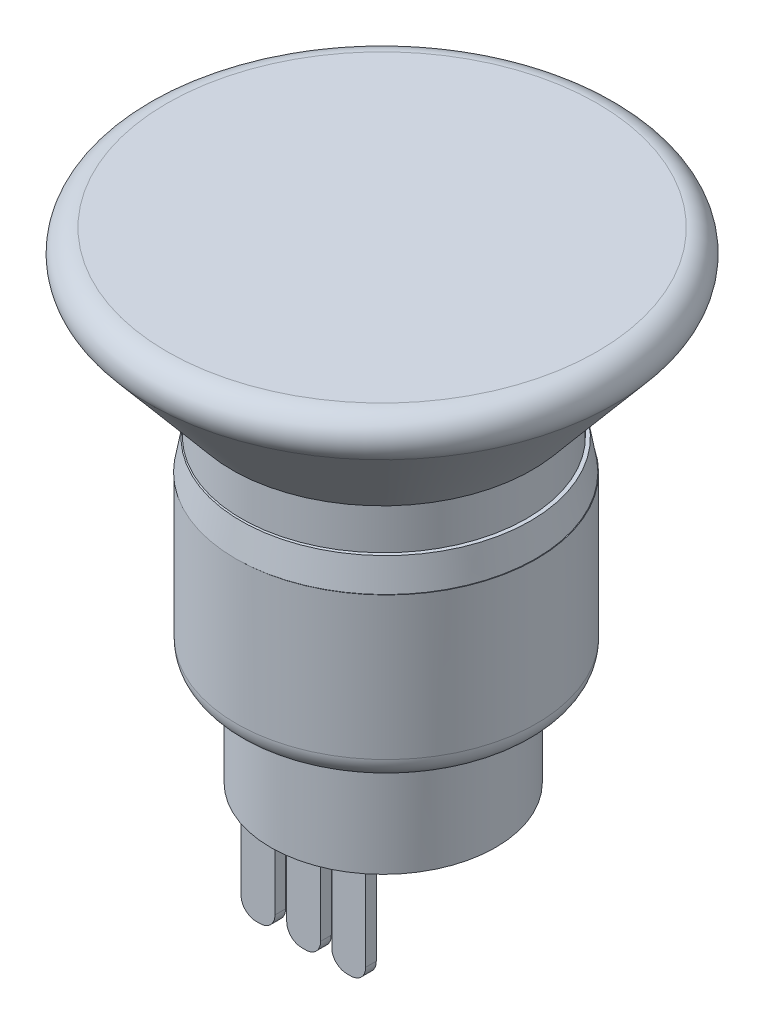
ISO-10303-21;
HEADER;
FILE_DESCRIPTION(('STEP AP214'),'2;1');
FILE_NAME('part.step','',(''),(''),'','','');
FILE_SCHEMA(('AUTOMOTIVE_DESIGN { 1 0 10303 214 1 1 1 1 }'));
ENDSEC;
DATA;
#1=APPLICATION_CONTEXT('core data for automotive mechanical design processes');
#2=APPLICATION_PROTOCOL_DEFINITION('international standard','automotive_design',2000,#1);
#3=PRODUCT_CONTEXT('',#1,'mechanical');
#4=PRODUCT('Part','Part','',(#3));
#5=PRODUCT_RELATED_PRODUCT_CATEGORY('part','',(#4));
#6=PRODUCT_DEFINITION_FORMATION('','',#4);
#7=PRODUCT_DEFINITION_CONTEXT('part definition',#1,'design');
#8=PRODUCT_DEFINITION('design','',#6,#7);
#9=PRODUCT_DEFINITION_SHAPE('','',#8);
#10=(LENGTH_UNIT() NAMED_UNIT(*) SI_UNIT(.MILLI.,.METRE.));
#11=(NAMED_UNIT(*) PLANE_ANGLE_UNIT() SI_UNIT($,.RADIAN.));
#12=(NAMED_UNIT(*) SI_UNIT($,.STERADIAN.) SOLID_ANGLE_UNIT());
#13=UNCERTAINTY_MEASURE_WITH_UNIT(LENGTH_MEASURE(1.E-05),#10,'distance_accuracy_value','');
#14=(GEOMETRIC_REPRESENTATION_CONTEXT(3) GLOBAL_UNCERTAINTY_ASSIGNED_CONTEXT((#13)) GLOBAL_UNIT_ASSIGNED_CONTEXT((#10,
#11,#12)) REPRESENTATION_CONTEXT('',''));
#15=CARTESIAN_POINT('',(0.,0.,0.));
#16=DIRECTION('',(0.,0.,1.));
#17=DIRECTION('',(1.,0.,0.));
#18=AXIS2_PLACEMENT_3D('',#15,#16,#17);
#19=CARTESIAN_POINT('',(-11.4120066992406,-26.4139194139194,0.));
#20=DIRECTION('',(0.,-1.,0.));
#21=DIRECTION('',(1.,0.,0.));
#22=AXIS2_PLACEMENT_3D('',#19,#20,#21);
#23=PLANE('',#22);
#24=CARTESIAN_POINT('',(-11.4120066992406,-26.4139194139194,0.));
#25=DIRECTION('',(0.,-1.,0.));
#26=DIRECTION('',(1.,0.,0.));
#27=AXIS2_PLACEMENT_3D('',#24,#25,#26);
#28=CIRCLE('',#27,7.5);
#29=CARTESIAN_POINT('',(-3.91200669924064,-26.4139194139194,0.));
#30=VERTEX_POINT('',#29);
#31=EDGE_CURVE('E290',#30,#30,#28,.T.);
#32=ORIENTED_EDGE('',*,*,#31,.T.);
#33=EDGE_LOOP('',(#32));
#34=FACE_BOUND('',#33,.T.);
#35=DIRECTION('',(1.,0.,0.));
#36=VECTOR('',#35,1.);
#37=CARTESIAN_POINT('',(-15.6345425409054,-26.4139194139194,4.54297184201655));
#38=LINE('',#37,#36);
#39=CARTESIAN_POINT('',(-15.6345425409054,-26.4139194139194,4.54297184201655));
#40=VERTEX_POINT('',#39);
#41=CARTESIAN_POINT('',(-13.3746491272111,-26.4139194139194,4.54297184201655));
#42=VERTEX_POINT('',#41);
#43=EDGE_CURVE('E268',#40,#42,#38,.T.);
#44=ORIENTED_EDGE('',*,*,#43,.F.);
#45=DIRECTION('',(0.,0.,-1.));
#46=VECTOR('',#45,1.);
#47=CARTESIAN_POINT('',(-15.6345425409054,-26.4139194139194,5.24918853379603));
#48=LINE('',#47,#46);
#49=CARTESIAN_POINT('',(-15.6345425409054,-26.4139194139194,5.24918853379603));
#50=VERTEX_POINT('',#49);
#51=EDGE_CURVE('E254',#50,#40,#48,.T.);
#52=ORIENTED_EDGE('',*,*,#51,.F.);
#53=DIRECTION('',(-1.,0.,0.));
#54=VECTOR('',#53,1.);
#55=CARTESIAN_POINT('',(-15.6345425409054,-26.4139194139194,5.24918853379603));
#56=LINE('',#55,#54);
#57=CARTESIAN_POINT('',(-13.3746491272111,-26.4139194139194,5.24918853379603));
#58=VERTEX_POINT('',#57);
#59=EDGE_CURVE('E260',#58,#50,#56,.T.);
#60=ORIENTED_EDGE('',*,*,#59,.F.);
#61=DIRECTION('',(0.,0.,1.));
#62=VECTOR('',#61,1.);
#63=CARTESIAN_POINT('',(-13.3746491272111,-26.4139194139194,5.24918853379603));
#64=LINE('',#63,#62);
#65=EDGE_CURVE('E272',#42,#58,#64,.T.);
#66=ORIENTED_EDGE('',*,*,#65,.F.);
#67=EDGE_LOOP('',(#44,#52,#60,#66));
#68=FACE_BOUND('',#67,.T.);
#69=DIRECTION('',(0.,0.,-1.));
#70=VECTOR('',#69,1.);
#71=CARTESIAN_POINT('',(-9.59060760962609,-26.4139194139194,5.24918853379603));
#72=LINE('',#71,#70);
#73=CARTESIAN_POINT('',(-9.59060760962609,-26.4139194139194,5.24918853379603));
#74=VERTEX_POINT('',#73);
#75=CARTESIAN_POINT('',(-9.59060760962609,-26.4139194139194,4.54297184201655));
#76=VERTEX_POINT('',#75);
#77=EDGE_CURVE('E232',#74,#76,#72,.T.);
#78=ORIENTED_EDGE('',*,*,#77,.F.);
#79=DIRECTION('',(-1.,0.,0.));
#80=VECTOR('',#79,1.);
#81=CARTESIAN_POINT('',(-7.33071419593175,-26.4139194139194,5.24918853379603));
#82=LINE('',#81,#80);
#83=CARTESIAN_POINT('',(-7.33071419593175,-26.4139194139194,5.24918853379603));
#84=VERTEX_POINT('',#83);
#85=EDGE_CURVE('E185',#84,#74,#82,.T.);
#86=ORIENTED_EDGE('',*,*,#85,.F.);
#87=DIRECTION('',(0.,0.,1.));
#88=VECTOR('',#87,1.);
#89=CARTESIAN_POINT('',(-7.33071419593175,-26.4139194139194,5.24918853379603));
#90=LINE('',#89,#88);
#91=CARTESIAN_POINT('',(-7.33071419593175,-26.4139194139194,4.54297184201655));
#92=VERTEX_POINT('',#91);
#93=EDGE_CURVE('E224',#92,#84,#90,.T.);
#94=ORIENTED_EDGE('',*,*,#93,.F.);
#95=DIRECTION('',(1.,0.,0.));
#96=VECTOR('',#95,1.);
#97=CARTESIAN_POINT('',(-7.33071419593175,-26.4139194139194,4.54297184201655));
#98=LINE('',#97,#96);
#99=EDGE_CURVE('E236',#76,#92,#98,.T.);
#100=ORIENTED_EDGE('',*,*,#99,.F.);
#101=EDGE_LOOP('',(#78,#86,#94,#100));
#102=FACE_BOUND('',#101,.T.);
#103=DIRECTION('',(0.,0.,-1.));
#104=VECTOR('',#103,1.);
#105=CARTESIAN_POINT('',(-12.5906076096261,-26.4139194139194,5.24918853379603));
#106=LINE('',#105,#104);
#107=CARTESIAN_POINT('',(-12.5906076096261,-26.4139194139194,5.24918853379603));
#108=VERTEX_POINT('',#107);
#109=CARTESIAN_POINT('',(-12.5906076096261,-26.4139194139194,4.54297184201655));
#110=VERTEX_POINT('',#109);
#111=EDGE_CURVE('E178',#108,#110,#106,.T.);
#112=ORIENTED_EDGE('',*,*,#111,.F.);
#113=DIRECTION('',(-1.,0.,0.));
#114=VECTOR('',#113,1.);
#115=CARTESIAN_POINT('',(-10.3307141959318,-26.4139194139194,5.24918853379603));
#116=LINE('',#115,#114);
#117=CARTESIAN_POINT('',(-10.3307141959318,-26.4139194139194,5.24918853379603));
#118=VERTEX_POINT('',#117);
#119=EDGE_CURVE('E189',#118,#108,#116,.T.);
#120=ORIENTED_EDGE('',*,*,#119,.F.);
#121=DIRECTION('',(0.,0.,1.));
#122=VECTOR('',#121,1.);
#123=CARTESIAN_POINT('',(-10.3307141959318,-26.4139194139194,5.24918853379603));
#124=LINE('',#123,#122);
#125=CARTESIAN_POINT('',(-10.3307141959318,-26.4139194139194,4.54297184201655));
#126=VERTEX_POINT('',#125);
#127=EDGE_CURVE('E204',#126,#118,#124,.T.);
#128=ORIENTED_EDGE('',*,*,#127,.F.);
#129=DIRECTION('',(1.,0.,0.));
#130=VECTOR('',#129,1.);
#131=CARTESIAN_POINT('',(-10.3307141959318,-26.4139194139194,4.54297184201655));
#132=LINE('',#131,#130);
#133=EDGE_CURVE('E200',#110,#126,#132,.T.);
#134=ORIENTED_EDGE('',*,*,#133,.F.);
#135=EDGE_LOOP('',(#112,#120,#128,#134));
#136=FACE_BOUND('',#135,.T.);
#137=ADVANCED_FACE('F41',(#34,#68,#102,#136),#23,.T.);
#138=CARTESIAN_POINT('',(-11.1983045941497,-8.41391941391942,0.));
#139=DIRECTION('',(0.,1.,0.));
#140=DIRECTION('',(-1.,0.,0.));
#141=AXIS2_PLACEMENT_3D('',#138,#139,#140);
#142=CYLINDRICAL_SURFACE('',#141,10.);
#143=CARTESIAN_POINT('',(-11.1983045941497,-17.9139194139194,0.));
#144=DIRECTION('',(0.,1.,0.));
#145=DIRECTION('',(-1.,0.,0.));
#146=AXIS2_PLACEMENT_3D('',#143,#144,#145);
#147=CIRCLE('',#146,10.);
#148=CARTESIAN_POINT('',(-21.1983045941497,-17.9139194139194,0.));
#149=VERTEX_POINT('',#148);
#150=EDGE_CURVE('E307',#149,#149,#147,.T.);
#151=ORIENTED_EDGE('',*,*,#150,.T.);
#152=EDGE_LOOP('',(#151));
#153=FACE_BOUND('',#152,.T.);
#154=CARTESIAN_POINT('',(-11.1983045941497,-8.41391941391942,0.));
#155=DIRECTION('',(0.,1.,0.));
#156=DIRECTION('',(-1.,0.,0.));
#157=AXIS2_PLACEMENT_3D('',#154,#155,#156);
#158=CIRCLE('',#157,10.);
#159=CARTESIAN_POINT('',(-11.2217838228673,-8.41391941391942,9.99997243625296));
#160=VERTEX_POINT('',#159);
#161=CARTESIAN_POINT('',(-11.2217838228673,-8.41391941391942,-9.99997243625296));
#162=VERTEX_POINT('',#161);
#163=EDGE_CURVE('E308',#160,#162,#158,.T.);
#164=ORIENTED_EDGE('',*,*,#163,.F.);
#165=EDGE_CURVE('E317',#162,#160,#158,.T.);
#166=ORIENTED_EDGE('',*,*,#165,.F.);
#167=EDGE_LOOP('',(#164,#166));
#168=FACE_BOUND('',#167,.T.);
#169=ADVANCED_FACE('F440',(#153,#168),#142,.T.);
#170=CARTESIAN_POINT('',(-21.1983045941497,-8.41391941391941,0.));
#171=DIRECTION('',(0.,-1.,0.));
#172=DIRECTION('',(1.,0.,0.));
#173=AXIS2_PLACEMENT_3D('',#170,#171,#172);
#174=PLANE('',#173);
#175=CARTESIAN_POINT('',(-11.2452630515843,-8.41391941391942,0.));
#176=DIRECTION('',(0.,1.,0.));
#177=DIRECTION('',(-1.,0.,0.));
#178=AXIS2_PLACEMENT_3D('',#175,#176,#177);
#179=CIRCLE('',#178,10.);
#180=EDGE_CURVE('E309',#160,#162,#179,.T.);
#181=ORIENTED_EDGE('',*,*,#180,.F.);
#182=ORIENTED_EDGE('',*,*,#163,.T.);
#183=EDGE_LOOP('',(#181,#182));
#184=FACE_BOUND('',#183,.T.);
#185=ADVANCED_FACE('F446',(#184),#174,.F.);
#186=CARTESIAN_POINT('',(-11.1983045941497,-19.4139194139194,0.));
#187=DIRECTION('',(0.,1.,0.));
#188=DIRECTION('',(-1.,0.,0.));
#189=AXIS2_PLACEMENT_3D('',#186,#187,#188);
#190=PLANE('',#189);
#191=CARTESIAN_POINT('',(-11.4120066992406,-19.4139194139194,0.));
#192=DIRECTION('',(0.,1.,0.));
#193=DIRECTION('',(-1.,0.,0.));
#194=AXIS2_PLACEMENT_3D('',#191,#192,#193);
#195=CIRCLE('',#194,7.5);
#196=CARTESIAN_POINT('',(-18.9120066992406,-19.4139194139194,0.));
#197=VERTEX_POINT('',#196);
#198=EDGE_CURVE('E335',#197,#197,#195,.F.);
#199=ORIENTED_EDGE('',*,*,#198,.F.);
#200=EDGE_LOOP('',(#199));
#201=FACE_BOUND('',#200,.T.);
#202=CARTESIAN_POINT('',(-11.1983045941497,-19.4139194139194,0.));
#203=DIRECTION('',(0.,1.,0.));
#204=DIRECTION('',(-1.,0.,0.));
#205=AXIS2_PLACEMENT_3D('',#202,#203,#204);
#206=CIRCLE('',#205,8.5);
#207=CARTESIAN_POINT('',(-19.6983045941497,-19.4139194139194,0.));
#208=VERTEX_POINT('',#207);
#209=EDGE_CURVE('E323',#208,#208,#206,.F.);
#210=ORIENTED_EDGE('',*,*,#209,.T.);
#211=EDGE_LOOP('',(#210));
#212=FACE_BOUND('',#211,.T.);
#213=ADVANCED_FACE('F484',(#201,#212),#190,.F.);
#214=CARTESIAN_POINT('',(-11.2452630515843,-8.41391941391942,0.));
#215=DIRECTION('',(0.,1.,0.));
#216=DIRECTION('',(-1.,0.,0.));
#217=AXIS2_PLACEMENT_3D('',#214,#215,#216);
#218=PLANE('',#217);
#219=EDGE_CURVE('E302',#162,#160,#179,.T.);
#220=ORIENTED_EDGE('',*,*,#219,.F.);
#221=ORIENTED_EDGE('',*,*,#165,.T.);
#222=EDGE_LOOP('',(#220,#221));
#223=FACE_BOUND('',#222,.T.);
#224=ADVANCED_FACE('F481',(#223),#218,.F.);
#225=CARTESIAN_POINT('',(-11.2452630515843,-8.41391941391942,0.));
#226=DIRECTION('',(0.,-1.,0.));
#227=DIRECTION('',(-1.,0.,0.));
#228=AXIS2_PLACEMENT_3D('',#225,#226,#227);
#229=CONICAL_SURFACE('',#228,10.,0.174532925199433);
#230=CARTESIAN_POINT('',(-11.2452630515843,-6.41391941391942,0.));
#231=DIRECTION('',(0.,1.,0.));
#232=DIRECTION('',(-1.,0.,0.));
#233=AXIS2_PLACEMENT_3D('',#230,#231,#232);
#234=CIRCLE('',#233,9.64734603858307);
#235=CARTESIAN_POINT('',(-20.8926090901673,-6.41391941391942,0.));
#236=VERTEX_POINT('',#235);
#237=EDGE_CURVE('E313',#236,#236,#234,.T.);
#238=ORIENTED_EDGE('',*,*,#237,.F.);
#239=EDGE_LOOP('',(#238));
#240=FACE_BOUND('',#239,.T.);
#241=ORIENTED_EDGE('',*,*,#180,.T.);
#242=ORIENTED_EDGE('',*,*,#219,.T.);
#243=EDGE_LOOP('',(#241,#242));
#244=FACE_BOUND('',#243,.T.);
#245=ADVANCED_FACE('F479',(#240,#244),#229,.T.);
#246=CARTESIAN_POINT('',(-11.2452630515843,-6.41391941391942,0.));
#247=DIRECTION('',(0.,1.,0.));
#248=DIRECTION('',(-1.,0.,0.));
#249=AXIS2_PLACEMENT_3D('',#246,#247,#248);
#250=PLANE('',#249);
#251=CARTESIAN_POINT('',(-11.3639457100014,-6.41391941391942,-1.22201846859908E-13));
#252=DIRECTION('',(0.,1.,0.));
#253=DIRECTION('',(-1.,0.,0.));
#254=AXIS2_PLACEMENT_3D('',#251,#252,#253);
#255=CIRCLE('',#254,9.5);
#256=CARTESIAN_POINT('',(-20.8639457100014,-6.41391941391942,-1.22201846859908E-13));
#257=VERTEX_POINT('',#256);
#258=EDGE_CURVE('E303',#257,#257,#255,.T.);
#259=ORIENTED_EDGE('',*,*,#258,.F.);
#260=EDGE_LOOP('',(#259));
#261=FACE_BOUND('',#260,.T.);
#262=ORIENTED_EDGE('',*,*,#237,.T.);
#263=EDGE_LOOP('',(#262));
#264=FACE_BOUND('',#263,.T.);
#265=ADVANCED_FACE('F475',(#261,#264),#250,.T.);
#266=CARTESIAN_POINT('',(-11.3639457100014,-3.41391941391942,-1.22201846859908E-13));
#267=DIRECTION('',(0.,-1.,0.));
#268=DIRECTION('',(1.,0.,0.));
#269=AXIS2_PLACEMENT_3D('',#266,#267,#268);
#270=CYLINDRICAL_SURFACE('',#269,9.5);
#271=CARTESIAN_POINT('',(-11.3639457100014,-3.41391941391942,-1.22201846859908E-13));
#272=DIRECTION('',(0.,1.,0.));
#273=DIRECTION('',(-1.,0.,0.));
#274=AXIS2_PLACEMENT_3D('',#271,#272,#273);
#275=CIRCLE('',#274,9.5);
#276=CARTESIAN_POINT('',(-20.8639457100014,-3.41391941391942,-1.22201846859908E-13));
#277=VERTEX_POINT('',#276);
#278=EDGE_CURVE('E298',#277,#277,#275,.T.);
#279=ORIENTED_EDGE('',*,*,#278,.F.);
#280=EDGE_LOOP('',(#279));
#281=FACE_BOUND('',#280,.T.);
#282=ORIENTED_EDGE('',*,*,#258,.T.);
#283=EDGE_LOOP('',(#282));
#284=FACE_BOUND('',#283,.T.);
#285=ADVANCED_FACE('F471',(#281,#284),#270,.T.);
#286=CARTESIAN_POINT('',(-11.4826283684186,-3.41391941391942,0.));
#287=DIRECTION('',(0.,1.,0.));
#288=DIRECTION('',(-1.,0.,0.));
#289=AXIS2_PLACEMENT_3D('',#286,#287,#288);
#290=CONICAL_SURFACE('',#289,10.,0.698131700797732);
#291=CARTESIAN_POINT('',(-11.4826283684186,3.12189917155077,0.));
#292=DIRECTION('',(0.,1.,0.));
#293=DIRECTION('',(-1.,0.,0.));
#294=AXIS2_PLACEMENT_3D('',#291,#292,#293);
#295=CIRCLE('',#294,15.4842029645097);
#296=CARTESIAN_POINT('',(-26.9668313329282,3.12189917155077,0.));
#297=VERTEX_POINT('',#296);
#298=EDGE_CURVE('E331',#297,#297,#295,.F.);
#299=ORIENTED_EDGE('',*,*,#298,.T.);
#300=EDGE_LOOP('',(#299));
#301=FACE_BOUND('',#300,.T.);
#302=CARTESIAN_POINT('',(-11.4826283684186,-3.41391941391942,0.));
#303=DIRECTION('',(0.,1.,0.));
#304=DIRECTION('',(-1.,0.,0.));
#305=AXIS2_PLACEMENT_3D('',#302,#303,#304);
#306=CIRCLE('',#305,10.);
#307=CARTESIAN_POINT('',(-21.4826283684186,-3.41391941391942,0.));
#308=VERTEX_POINT('',#307);
#309=EDGE_CURVE('E294',#308,#308,#306,.T.);
#310=ORIENTED_EDGE('',*,*,#309,.T.);
#311=EDGE_LOOP('',(#310));
#312=FACE_BOUND('',#311,.T.);
#313=ADVANCED_FACE('F463',(#301,#312),#290,.T.);
#314=CARTESIAN_POINT('',(-11.4826283684186,5.58608058608058,0.));
#315=DIRECTION('',(0.,1.,0.));
#316=DIRECTION('',(-1.,0.,0.));
#317=AXIS2_PLACEMENT_3D('',#314,#315,#316);
#318=PLANE('',#317);
#319=CARTESIAN_POINT('',(-11.4826283684186,5.58608058608058,0.));
#320=DIRECTION('',(0.,1.,0.));
#321=DIRECTION('',(-1.,0.,0.));
#322=AXIS2_PLACEMENT_3D('',#319,#320,#321);
#323=CIRCLE('',#322,14.3351362998312);
#324=CARTESIAN_POINT('',(-25.8177646682498,5.58608058608058,0.));
#325=VERTEX_POINT('',#324);
#326=EDGE_CURVE('E327',#325,#325,#323,.T.);
#327=ORIENTED_EDGE('',*,*,#326,.T.);
#328=EDGE_LOOP('',(#327));
#329=FACE_BOUND('',#328,.T.);
#330=ADVANCED_FACE('F459',(#329),#318,.T.);
#331=CARTESIAN_POINT('',(-11.4826283684186,-3.41391941391942,0.));
#332=DIRECTION('',(0.,1.,0.));
#333=DIRECTION('',(-1.,0.,0.));
#334=AXIS2_PLACEMENT_3D('',#331,#332,#333);
#335=PLANE('',#334);
#336=ORIENTED_EDGE('',*,*,#278,.T.);
#337=EDGE_LOOP('',(#336));
#338=FACE_BOUND('',#337,.T.);
#339=ORIENTED_EDGE('',*,*,#309,.F.);
#340=EDGE_LOOP('',(#339));
#341=FACE_BOUND('',#340,.T.);
#342=ADVANCED_FACE('F462',(#338,#341),#335,.F.);
#343=CARTESIAN_POINT('',(-11.1983045941497,-17.9139194139194,0.));
#344=DIRECTION('',(0.,1.,0.));
#345=DIRECTION('',(-1.,0.,0.));
#346=AXIS2_PLACEMENT_3D('',#343,#344,#345);
#347=TOROIDAL_SURFACE('',#346,8.5,1.5);
#348=ORIENTED_EDGE('',*,*,#209,.F.);
#349=EDGE_LOOP('',(#348));
#350=FACE_BOUND('',#349,.T.);
#351=ORIENTED_EDGE('',*,*,#150,.F.);
#352=EDGE_LOOP('',(#351));
#353=FACE_BOUND('',#352,.T.);
#354=ADVANCED_FACE('F467',(#350,#353),#347,.T.);
#355=CARTESIAN_POINT('',(-11.4826283684186,4.08608058608058,0.));
#356=DIRECTION('',(0.,1.,0.));
#357=DIRECTION('',(-1.,0.,0.));
#358=AXIS2_PLACEMENT_3D('',#355,#356,#357);
#359=TOROIDAL_SURFACE('',#358,14.3351362998312,1.5);
#360=ORIENTED_EDGE('',*,*,#298,.F.);
#361=EDGE_LOOP('',(#360));
#362=FACE_BOUND('',#361,.T.);
#363=ORIENTED_EDGE('',*,*,#326,.F.);
#364=EDGE_LOOP('',(#363));
#365=FACE_BOUND('',#364,.T.);
#366=ADVANCED_FACE('F457',(#362,#365),#359,.T.);
#367=CARTESIAN_POINT('',(-11.4120066992406,-26.4139194139194,0.));
#368=DIRECTION('',(0.,1.,0.));
#369=DIRECTION('',(-1.,0.,0.));
#370=AXIS2_PLACEMENT_3D('',#367,#368,#369);
#371=CYLINDRICAL_SURFACE('',#370,7.5);
#372=ORIENTED_EDGE('',*,*,#31,.F.);
#373=EDGE_LOOP('',(#372));
#374=FACE_BOUND('',#373,.T.);
#375=ORIENTED_EDGE('',*,*,#198,.T.);
#376=EDGE_LOOP('',(#375));
#377=FACE_BOUND('',#376,.T.);
#378=ADVANCED_FACE('F454',(#374,#377),#371,.T.);
#379=CARTESIAN_POINT('',(-15.6345425409054,-33.4139194139194,5.24918853379603));
#380=DIRECTION('',(1.,0.,0.));
#381=DIRECTION('',(0.,1.,0.));
#382=AXIS2_PLACEMENT_3D('',#379,#380,#381);
#383=PLANE('',#382);
#384=DIRECTION('',(0.,1.,0.));
#385=VECTOR('',#384,1.);
#386=CARTESIAN_POINT('',(-15.6345425409054,-33.4139194139194,4.54297184201655));
#387=LINE('',#386,#385);
#388=CARTESIAN_POINT('',(-15.6345425409054,-32.4139194139194,4.54297184201655));
#389=VERTEX_POINT('',#388);
#390=EDGE_CURVE('E287',#389,#40,#387,.T.);
#391=ORIENTED_EDGE('',*,*,#390,.F.);
#392=DIRECTION('',(0.,0.,-1.));
#393=VECTOR('',#392,1.);
#394=CARTESIAN_POINT('',(-15.6345425409054,-32.4139194139194,5.24918853379603));
#395=LINE('',#394,#393);
#396=CARTESIAN_POINT('',(-15.6345425409054,-32.4139194139194,5.24918853379603));
#397=VERTEX_POINT('',#396);
#398=EDGE_CURVE('E378',#389,#397,#395,.F.);
#399=ORIENTED_EDGE('',*,*,#398,.T.);
#400=DIRECTION('',(0.,1.,0.));
#401=VECTOR('',#400,1.);
#402=CARTESIAN_POINT('',(-15.6345425409054,-33.4139194139194,5.24918853379603));
#403=LINE('',#402,#401);
#404=EDGE_CURVE('E264',#397,#50,#403,.T.);
#405=ORIENTED_EDGE('',*,*,#404,.T.);
#406=ORIENTED_EDGE('',*,*,#51,.T.);
#407=EDGE_LOOP('',(#391,#399,#405,#406));
#408=FACE_BOUND('',#407,.T.);
#409=ADVANCED_FACE('F452',(#408),#383,.F.);
#410=CARTESIAN_POINT('',(-15.6345425409054,-33.4139194139194,4.54297184201655));
#411=DIRECTION('',(0.,0.,1.));
#412=DIRECTION('',(1.,0.,0.));
#413=AXIS2_PLACEMENT_3D('',#410,#411,#412);
#414=PLANE('',#413);
#415=DIRECTION('',(1.,0.,0.));
#416=VECTOR('',#415,1.);
#417=CARTESIAN_POINT('',(-15.6345425409054,-33.4139194139194,4.54297184201655));
#418=LINE('',#417,#416);
#419=CARTESIAN_POINT('',(-14.6345425409054,-33.4139194139194,4.54297184201655));
#420=VERTEX_POINT('',#419);
#421=CARTESIAN_POINT('',(-14.3746491272111,-33.4139194139194,4.54297184201655));
#422=VERTEX_POINT('',#421);
#423=EDGE_CURVE('E255',#420,#422,#418,.T.);
#424=ORIENTED_EDGE('',*,*,#423,.F.);
#425=CARTESIAN_POINT('',(-14.6345425409054,-32.4139194139194,4.54297184201655));
#426=DIRECTION('',(0.,0.,1.));
#427=DIRECTION('',(1.,0.,0.));
#428=AXIS2_PLACEMENT_3D('',#425,#426,#427);
#429=CIRCLE('',#428,1.);
#430=EDGE_CURVE('E375',#420,#389,#429,.F.);
#431=ORIENTED_EDGE('',*,*,#430,.T.);
#432=ORIENTED_EDGE('',*,*,#390,.T.);
#433=ORIENTED_EDGE('',*,*,#43,.T.);
#434=DIRECTION('',(0.,1.,0.));
#435=VECTOR('',#434,1.);
#436=CARTESIAN_POINT('',(-13.3746491272111,-33.4139194139194,4.54297184201655));
#437=LINE('',#436,#435);
#438=CARTESIAN_POINT('',(-13.3746491272111,-32.4139194139194,4.54297184201655));
#439=VERTEX_POINT('',#438);
#440=EDGE_CURVE('E284',#439,#42,#437,.T.);
#441=ORIENTED_EDGE('',*,*,#440,.F.);
#442=CARTESIAN_POINT('',(-14.3746491272111,-32.4139194139194,4.54297184201655));
#443=DIRECTION('',(0.,0.,1.));
#444=DIRECTION('',(1.,0.,0.));
#445=AXIS2_PLACEMENT_3D('',#442,#443,#444);
#446=CIRCLE('',#445,1.);
#447=EDGE_CURVE('E372',#439,#422,#446,.F.);
#448=ORIENTED_EDGE('',*,*,#447,.T.);
#449=EDGE_LOOP('',(#424,#431,#432,#433,#441,#448));
#450=FACE_BOUND('',#449,.T.);
#451=ADVANCED_FACE('F662',(#450),#414,.F.);
#452=CARTESIAN_POINT('',(-13.3746491272111,-33.4139194139194,5.24918853379603));
#453=DIRECTION('',(-1.,0.,0.));
#454=DIRECTION('',(0.,-1.,0.));
#455=AXIS2_PLACEMENT_3D('',#452,#453,#454);
#456=PLANE('',#455);
#457=DIRECTION('',(0.,1.,0.));
#458=VECTOR('',#457,1.);
#459=CARTESIAN_POINT('',(-13.3746491272111,-33.4139194139194,5.24918853379603));
#460=LINE('',#459,#458);
#461=CARTESIAN_POINT('',(-13.3746491272111,-32.4139194139194,5.24918853379603));
#462=VERTEX_POINT('',#461);
#463=EDGE_CURVE('E281',#462,#58,#460,.T.);
#464=ORIENTED_EDGE('',*,*,#463,.F.);
#465=DIRECTION('',(0.,0.,1.));
#466=VECTOR('',#465,1.);
#467=CARTESIAN_POINT('',(-13.3746491272111,-32.4139194139194,4.54297184201655));
#468=LINE('',#467,#466);
#469=EDGE_CURVE('E387',#462,#439,#468,.F.);
#470=ORIENTED_EDGE('',*,*,#469,.T.);
#471=ORIENTED_EDGE('',*,*,#440,.T.);
#472=ORIENTED_EDGE('',*,*,#65,.T.);
#473=EDGE_LOOP('',(#464,#470,#471,#472));
#474=FACE_BOUND('',#473,.T.);
#475=ADVANCED_FACE('F652',(#474),#456,.F.);
#476=CARTESIAN_POINT('',(-15.6345425409054,-33.4139194139194,5.24918853379603));
#477=DIRECTION('',(0.,0.,-1.));
#478=DIRECTION('',(-1.,0.,0.));
#479=AXIS2_PLACEMENT_3D('',#476,#477,#478);
#480=PLANE('',#479);
#481=ORIENTED_EDGE('',*,*,#404,.F.);
#482=CARTESIAN_POINT('',(-14.6345425409054,-32.4139194139194,5.24918853379603));
#483=DIRECTION('',(0.,0.,-1.));
#484=DIRECTION('',(-1.,0.,0.));
#485=AXIS2_PLACEMENT_3D('',#482,#483,#484);
#486=CIRCLE('',#485,1.);
#487=CARTESIAN_POINT('',(-14.6345425409054,-33.4139194139194,5.24918853379603));
#488=VERTEX_POINT('',#487);
#489=EDGE_CURVE('E384',#397,#488,#486,.F.);
#490=ORIENTED_EDGE('',*,*,#489,.T.);
#491=DIRECTION('',(-1.,0.,0.));
#492=VECTOR('',#491,1.);
#493=CARTESIAN_POINT('',(-15.6345425409054,-33.4139194139194,5.24918853379603));
#494=LINE('',#493,#492);
#495=CARTESIAN_POINT('',(-14.3746491272111,-33.4139194139194,5.24918853379603));
#496=VERTEX_POINT('',#495);
#497=EDGE_CURVE('E259',#496,#488,#494,.T.);
#498=ORIENTED_EDGE('',*,*,#497,.F.);
#499=CARTESIAN_POINT('',(-14.3746491272111,-32.4139194139194,5.24918853379603));
#500=DIRECTION('',(0.,0.,-1.));
#501=DIRECTION('',(-1.,0.,0.));
#502=AXIS2_PLACEMENT_3D('',#499,#500,#501);
#503=CIRCLE('',#502,1.);
#504=EDGE_CURVE('E381',#496,#462,#503,.F.);
#505=ORIENTED_EDGE('',*,*,#504,.T.);
#506=ORIENTED_EDGE('',*,*,#463,.T.);
#507=ORIENTED_EDGE('',*,*,#59,.T.);
#508=EDGE_LOOP('',(#481,#490,#498,#505,#506,#507));
#509=FACE_BOUND('',#508,.T.);
#510=ADVANCED_FACE('F641',(#509),#480,.F.);
#511=CARTESIAN_POINT('',(0.,-33.4139194139194,0.));
#512=DIRECTION('',(0.,-1.,0.));
#513=DIRECTION('',(0.,0.,-1.));
#514=AXIS2_PLACEMENT_3D('',#511,#512,#513);
#515=PLANE('',#514);
#516=ORIENTED_EDGE('',*,*,#497,.T.);
#517=DIRECTION('',(0.,0.,-1.));
#518=VECTOR('',#517,1.);
#519=CARTESIAN_POINT('',(-14.6345425409054,-33.4139194139194,4.54297184201655));
#520=LINE('',#519,#518);
#521=EDGE_CURVE('E368',#488,#420,#520,.T.);
#522=ORIENTED_EDGE('',*,*,#521,.T.);
#523=ORIENTED_EDGE('',*,*,#423,.T.);
#524=DIRECTION('',(0.,0.,1.));
#525=VECTOR('',#524,1.);
#526=CARTESIAN_POINT('',(-14.3746491272111,-33.4139194139194,5.24918853379603));
#527=LINE('',#526,#525);
#528=EDGE_CURVE('E364',#422,#496,#527,.T.);
#529=ORIENTED_EDGE('',*,*,#528,.T.);
#530=EDGE_LOOP('',(#516,#522,#523,#529));
#531=FACE_BOUND('',#530,.T.);
#532=ADVANCED_FACE('F632',(#531),#515,.T.);
#533=CARTESIAN_POINT('',(-7.33071419593176,-33.4139194139194,5.24918853379603));
#534=DIRECTION('',(0.,0.,-1.));
#535=DIRECTION('',(-1.,0.,0.));
#536=AXIS2_PLACEMENT_3D('',#533,#534,#535);
#537=PLANE('',#536);
#538=DIRECTION('',(0.,1.,0.));
#539=VECTOR('',#538,1.);
#540=CARTESIAN_POINT('',(-9.5906076096261,-33.4139194139194,5.24918853379603));
#541=LINE('',#540,#539);
#542=CARTESIAN_POINT('',(-9.5906076096261,-32.4139194139194,5.24918853379603));
#543=VERTEX_POINT('',#542);
#544=EDGE_CURVE('E251',#543,#74,#541,.T.);
#545=ORIENTED_EDGE('',*,*,#544,.F.);
#546=CARTESIAN_POINT('',(-8.5906076096261,-32.4139194139194,5.24918853379603));
#547=DIRECTION('',(0.,0.,-1.));
#548=DIRECTION('',(-1.,0.,0.));
#549=AXIS2_PLACEMENT_3D('',#546,#547,#548);
#550=CIRCLE('',#549,1.);
#551=CARTESIAN_POINT('',(-8.5906076096261,-33.4139194139194,5.24918853379603));
#552=VERTEX_POINT('',#551);
#553=EDGE_CURVE('E50',#543,#552,#550,.F.);
#554=ORIENTED_EDGE('',*,*,#553,.T.);
#555=DIRECTION('',(-1.,0.,0.));
#556=VECTOR('',#555,1.);
#557=CARTESIAN_POINT('',(-7.33071419593176,-33.4139194139194,5.24918853379603));
#558=LINE('',#557,#556);
#559=CARTESIAN_POINT('',(-8.33071419593175,-33.4139194139194,5.24918853379603));
#560=VERTEX_POINT('',#559);
#561=EDGE_CURVE('E219',#560,#552,#558,.T.);
#562=ORIENTED_EDGE('',*,*,#561,.F.);
#563=CARTESIAN_POINT('',(-8.33071419593175,-32.4139194139194,5.24918853379603));
#564=DIRECTION('',(0.,0.,-1.));
#565=DIRECTION('',(-1.,0.,0.));
#566=AXIS2_PLACEMENT_3D('',#563,#564,#565);
#567=CIRCLE('',#566,1.);
#568=CARTESIAN_POINT('',(-7.33071419593175,-32.4139194139194,5.24918853379603));
#569=VERTEX_POINT('',#568);
#570=EDGE_CURVE('E57',#560,#569,#567,.F.);
#571=ORIENTED_EDGE('',*,*,#570,.T.);
#572=DIRECTION('',(0.,1.,0.));
#573=VECTOR('',#572,1.);
#574=CARTESIAN_POINT('',(-7.33071419593176,-33.4139194139194,5.24918853379603));
#575=LINE('',#574,#573);
#576=EDGE_CURVE('E228',#569,#84,#575,.T.);
#577=ORIENTED_EDGE('',*,*,#576,.T.);
#578=ORIENTED_EDGE('',*,*,#85,.T.);
#579=EDGE_LOOP('',(#545,#554,#562,#571,#577,#578));
#580=FACE_BOUND('',#579,.T.);
#581=ADVANCED_FACE('F409',(#580),#537,.F.);
#582=CARTESIAN_POINT('',(-9.5906076096261,-33.4139194139194,5.24918853379603));
#583=DIRECTION('',(1.,0.,0.));
#584=DIRECTION('',(0.,1.,0.));
#585=AXIS2_PLACEMENT_3D('',#582,#583,#584);
#586=PLANE('',#585);
#587=DIRECTION('',(0.,1.,0.));
#588=VECTOR('',#587,1.);
#589=CARTESIAN_POINT('',(-9.5906076096261,-33.4139194139194,4.54297184201655));
#590=LINE('',#589,#588);
#591=CARTESIAN_POINT('',(-9.5906076096261,-32.4139194139194,4.54297184201655));
#592=VERTEX_POINT('',#591);
#593=EDGE_CURVE('E248',#592,#76,#590,.T.);
#594=ORIENTED_EDGE('',*,*,#593,.F.);
#595=DIRECTION('',(0.,0.,-1.));
#596=VECTOR('',#595,1.);
#597=CARTESIAN_POINT('',(-9.5906076096261,-32.4139194139194,5.24918853379603));
#598=LINE('',#597,#596);
#599=EDGE_CURVE('E65',#592,#543,#598,.F.);
#600=ORIENTED_EDGE('',*,*,#599,.T.);
#601=ORIENTED_EDGE('',*,*,#544,.T.);
#602=ORIENTED_EDGE('',*,*,#77,.T.);
#603=EDGE_LOOP('',(#594,#600,#601,#602));
#604=FACE_BOUND('',#603,.T.);
#605=ADVANCED_FACE('F419',(#604),#586,.F.);
#606=CARTESIAN_POINT('',(-7.33071419593176,-33.4139194139194,4.54297184201655));
#607=DIRECTION('',(0.,0.,1.));
#608=DIRECTION('',(1.,0.,0.));
#609=AXIS2_PLACEMENT_3D('',#606,#607,#608);
#610=PLANE('',#609);
#611=DIRECTION('',(1.,0.,0.));
#612=VECTOR('',#611,1.);
#613=CARTESIAN_POINT('',(-7.33071419593176,-33.4139194139194,4.54297184201655));
#614=LINE('',#613,#612);
#615=CARTESIAN_POINT('',(-8.5906076096261,-33.4139194139194,4.54297184201655));
#616=VERTEX_POINT('',#615);
#617=CARTESIAN_POINT('',(-8.33071419593175,-33.4139194139194,4.54297184201655));
#618=VERTEX_POINT('',#617);
#619=EDGE_CURVE('E223',#616,#618,#614,.T.);
#620=ORIENTED_EDGE('',*,*,#619,.F.);
#621=CARTESIAN_POINT('',(-8.5906076096261,-32.4139194139194,4.54297184201655));
#622=DIRECTION('',(0.,0.,1.));
#623=DIRECTION('',(1.,0.,0.));
#624=AXIS2_PLACEMENT_3D('',#621,#622,#623);
#625=CIRCLE('',#624,1.);
#626=EDGE_CURVE('E401',#616,#592,#625,.F.);
#627=ORIENTED_EDGE('',*,*,#626,.T.);
#628=ORIENTED_EDGE('',*,*,#593,.T.);
#629=ORIENTED_EDGE('',*,*,#99,.T.);
#630=DIRECTION('',(0.,1.,0.));
#631=VECTOR('',#630,1.);
#632=CARTESIAN_POINT('',(-7.33071419593176,-33.4139194139194,4.54297184201655));
#633=LINE('',#632,#631);
#634=CARTESIAN_POINT('',(-7.33071419593175,-32.4139194139194,4.54297184201655));
#635=VERTEX_POINT('',#634);
#636=EDGE_CURVE('E245',#635,#92,#633,.T.);
#637=ORIENTED_EDGE('',*,*,#636,.F.);
#638=CARTESIAN_POINT('',(-8.33071419593175,-32.4139194139194,4.54297184201655));
#639=DIRECTION('',(0.,0.,1.));
#640=DIRECTION('',(1.,0.,0.));
#641=AXIS2_PLACEMENT_3D('',#638,#639,#640);
#642=CIRCLE('',#641,1.);
#643=EDGE_CURVE('E398',#635,#618,#642,.F.);
#644=ORIENTED_EDGE('',*,*,#643,.T.);
#645=EDGE_LOOP('',(#620,#627,#628,#629,#637,#644));
#646=FACE_BOUND('',#645,.T.);
#647=ADVANCED_FACE('F418',(#646),#610,.F.);
#648=CARTESIAN_POINT('',(-7.33071419593176,-33.4139194139194,5.24918853379603));
#649=DIRECTION('',(-1.,0.,0.));
#650=DIRECTION('',(0.,-1.,0.));
#651=AXIS2_PLACEMENT_3D('',#648,#649,#650);
#652=PLANE('',#651);
#653=ORIENTED_EDGE('',*,*,#576,.F.);
#654=DIRECTION('',(0.,0.,1.));
#655=VECTOR('',#654,1.);
#656=CARTESIAN_POINT('',(-7.33071419593176,-32.4139194139194,4.54297184201655));
#657=LINE('',#656,#655);
#658=EDGE_CURVE('E11',#569,#635,#657,.F.);
#659=ORIENTED_EDGE('',*,*,#658,.T.);
#660=ORIENTED_EDGE('',*,*,#636,.T.);
#661=ORIENTED_EDGE('',*,*,#93,.T.);
#662=EDGE_LOOP('',(#653,#659,#660,#661));
#663=FACE_BOUND('',#662,.T.);
#664=ADVANCED_FACE('F430',(#663),#652,.F.);
#665=CARTESIAN_POINT('',(0.,-33.4139194139194,0.));
#666=DIRECTION('',(0.,-1.,0.));
#667=DIRECTION('',(0.,0.,-1.));
#668=AXIS2_PLACEMENT_3D('',#665,#666,#667);
#669=PLANE('',#668);
#670=ORIENTED_EDGE('',*,*,#561,.T.);
#671=DIRECTION('',(0.,0.,-1.));
#672=VECTOR('',#671,1.);
#673=CARTESIAN_POINT('',(-8.5906076096261,-33.4139194139194,4.54297184201655));
#674=LINE('',#673,#672);
#675=EDGE_CURVE('E394',#552,#616,#674,.T.);
#676=ORIENTED_EDGE('',*,*,#675,.T.);
#677=ORIENTED_EDGE('',*,*,#619,.T.);
#678=DIRECTION('',(0.,0.,1.));
#679=VECTOR('',#678,1.);
#680=CARTESIAN_POINT('',(-8.33071419593175,-33.4139194139194,5.24918853379603));
#681=LINE('',#680,#679);
#682=EDGE_CURVE('E390',#618,#560,#681,.T.);
#683=ORIENTED_EDGE('',*,*,#682,.T.);
#684=EDGE_LOOP('',(#670,#676,#677,#683));
#685=FACE_BOUND('',#684,.T.);
#686=ADVANCED_FACE('F413',(#685),#669,.T.);
#687=CARTESIAN_POINT('',(-10.3307141959318,-33.4139194139194,5.24918853379603));
#688=DIRECTION('',(0.,0.,-1.));
#689=DIRECTION('',(-1.,0.,0.));
#690=AXIS2_PLACEMENT_3D('',#687,#688,#689);
#691=PLANE('',#690);
#692=DIRECTION('',(-1.,0.,0.));
#693=VECTOR('',#692,1.);
#694=CARTESIAN_POINT('',(-10.3307141959318,-33.4139194139194,5.24918853379603));
#695=LINE('',#694,#693);
#696=CARTESIAN_POINT('',(-11.3307141959318,-33.4139194139194,5.24918853379603));
#697=VERTEX_POINT('',#696);
#698=CARTESIAN_POINT('',(-11.5906076096261,-33.4139194139194,5.24918853379603));
#699=VERTEX_POINT('',#698);
#700=EDGE_CURVE('E210',#697,#699,#695,.T.);
#701=ORIENTED_EDGE('',*,*,#700,.F.);
#702=CARTESIAN_POINT('',(-11.3307141959318,-32.4139194139194,5.24918853379603));
#703=DIRECTION('',(0.,0.,-1.));
#704=DIRECTION('',(-1.,0.,0.));
#705=AXIS2_PLACEMENT_3D('',#702,#703,#704);
#706=CIRCLE('',#705,1.);
#707=CARTESIAN_POINT('',(-10.3307141959318,-32.4139194139194,5.24918853379603));
#708=VERTEX_POINT('',#707);
#709=EDGE_CURVE('E350',#697,#708,#706,.F.);
#710=ORIENTED_EDGE('',*,*,#709,.T.);
#711=DIRECTION('',(0.,1.,0.));
#712=VECTOR('',#711,1.);
#713=CARTESIAN_POINT('',(-10.3307141959318,-33.4139194139194,5.24918853379603));
#714=LINE('',#713,#712);
#715=EDGE_CURVE('E193',#708,#118,#714,.T.);
#716=ORIENTED_EDGE('',*,*,#715,.T.);
#717=ORIENTED_EDGE('',*,*,#119,.T.);
#718=DIRECTION('',(0.,1.,0.));
#719=VECTOR('',#718,1.);
#720=CARTESIAN_POINT('',(-12.5906076096261,-33.4139194139194,5.24918853379603));
#721=LINE('',#720,#719);
#722=CARTESIAN_POINT('',(-12.5906076096261,-32.4139194139194,5.24918853379603));
#723=VERTEX_POINT('',#722);
#724=EDGE_CURVE('E173',#723,#108,#721,.T.);
#725=ORIENTED_EDGE('',*,*,#724,.F.);
#726=CARTESIAN_POINT('',(-11.5906076096261,-32.4139194139194,5.24918853379603));
#727=DIRECTION('',(0.,0.,-1.));
#728=DIRECTION('',(-1.,0.,0.));
#729=AXIS2_PLACEMENT_3D('',#726,#727,#728);
#730=CIRCLE('',#729,1.);
#731=EDGE_CURVE('E347',#723,#699,#730,.F.);
#732=ORIENTED_EDGE('',*,*,#731,.T.);
#733=EDGE_LOOP('',(#701,#710,#716,#717,#725,#732));
#734=FACE_BOUND('',#733,.T.);
#735=ADVANCED_FACE('F191',(#734),#691,.F.);
#736=CARTESIAN_POINT('',(-12.5906076096261,-33.4139194139194,5.24918853379603));
#737=DIRECTION('',(1.,0.,0.));
#738=DIRECTION('',(0.,1.,0.));
#739=AXIS2_PLACEMENT_3D('',#736,#737,#738);
#740=PLANE('',#739);
#741=DIRECTION('',(0.,1.,0.));
#742=VECTOR('',#741,1.);
#743=CARTESIAN_POINT('',(-12.5906076096261,-33.4139194139194,4.54297184201655));
#744=LINE('',#743,#742);
#745=CARTESIAN_POINT('',(-12.5906076096261,-32.4139194139194,4.54297184201655));
#746=VERTEX_POINT('',#745);
#747=EDGE_CURVE('E186',#746,#110,#744,.T.);
#748=ORIENTED_EDGE('',*,*,#747,.F.);
#749=DIRECTION('',(0.,0.,-1.));
#750=VECTOR('',#749,1.);
#751=CARTESIAN_POINT('',(-12.5906076096261,-32.4139194139194,5.24918853379603));
#752=LINE('',#751,#750);
#753=EDGE_CURVE('E181',#746,#723,#752,.F.);
#754=ORIENTED_EDGE('',*,*,#753,.T.);
#755=ORIENTED_EDGE('',*,*,#724,.T.);
#756=ORIENTED_EDGE('',*,*,#111,.T.);
#757=EDGE_LOOP('',(#748,#754,#755,#756));
#758=FACE_BOUND('',#757,.T.);
#759=ADVANCED_FACE('F176',(#758),#740,.F.);
#760=CARTESIAN_POINT('',(-10.3307141959318,-33.4139194139194,4.54297184201655));
#761=DIRECTION('',(0.,0.,1.));
#762=DIRECTION('',(1.,0.,0.));
#763=AXIS2_PLACEMENT_3D('',#760,#761,#762);
#764=PLANE('',#763);
#765=DIRECTION('',(0.,1.,0.));
#766=VECTOR('',#765,1.);
#767=CARTESIAN_POINT('',(-10.3307141959318,-33.4139194139194,4.54297184201655));
#768=LINE('',#767,#766);
#769=CARTESIAN_POINT('',(-10.3307141959318,-32.4139194139194,4.54297184201655));
#770=VERTEX_POINT('',#769);
#771=EDGE_CURVE('E213',#770,#126,#768,.T.);
#772=ORIENTED_EDGE('',*,*,#771,.F.);
#773=CARTESIAN_POINT('',(-11.3307141959318,-32.4139194139194,4.54297184201655));
#774=DIRECTION('',(0.,0.,1.));
#775=DIRECTION('',(1.,0.,0.));
#776=AXIS2_PLACEMENT_3D('',#773,#774,#775);
#777=CIRCLE('',#776,1.);
#778=CARTESIAN_POINT('',(-11.3307141959318,-33.4139194139194,4.54297184201655));
#779=VERTEX_POINT('',#778);
#780=EDGE_CURVE('E359',#770,#779,#777,.F.);
#781=ORIENTED_EDGE('',*,*,#780,.T.);
#782=DIRECTION('',(1.,0.,0.));
#783=VECTOR('',#782,1.);
#784=CARTESIAN_POINT('',(-10.3307141959318,-33.4139194139194,4.54297184201655));
#785=LINE('',#784,#783);
#786=CARTESIAN_POINT('',(-11.5906076096261,-33.4139194139194,4.54297184201655));
#787=VERTEX_POINT('',#786);
#788=EDGE_CURVE('E214',#787,#779,#785,.T.);
#789=ORIENTED_EDGE('',*,*,#788,.F.);
#790=CARTESIAN_POINT('',(-11.5906076096261,-32.4139194139194,4.54297184201655));
#791=DIRECTION('',(0.,0.,1.));
#792=DIRECTION('',(1.,0.,0.));
#793=AXIS2_PLACEMENT_3D('',#790,#791,#792);
#794=CIRCLE('',#793,1.);
#795=EDGE_CURVE('E356',#787,#746,#794,.F.);
#796=ORIENTED_EDGE('',*,*,#795,.T.);
#797=ORIENTED_EDGE('',*,*,#747,.T.);
#798=ORIENTED_EDGE('',*,*,#133,.T.);
#799=EDGE_LOOP('',(#772,#781,#789,#796,#797,#798));
#800=FACE_BOUND('',#799,.T.);
#801=ADVANCED_FACE('F570',(#800),#764,.F.);
#802=CARTESIAN_POINT('',(-10.3307141959318,-33.4139194139194,5.24918853379603));
#803=DIRECTION('',(-1.,0.,0.));
#804=DIRECTION('',(0.,-1.,0.));
#805=AXIS2_PLACEMENT_3D('',#802,#803,#804);
#806=PLANE('',#805);
#807=ORIENTED_EDGE('',*,*,#715,.F.);
#808=DIRECTION('',(0.,0.,1.));
#809=VECTOR('',#808,1.);
#810=CARTESIAN_POINT('',(-10.3307141959318,-32.4139194139194,4.54297184201655));
#811=LINE('',#810,#809);
#812=EDGE_CURVE('E353',#708,#770,#811,.F.);
#813=ORIENTED_EDGE('',*,*,#812,.T.);
#814=ORIENTED_EDGE('',*,*,#771,.T.);
#815=ORIENTED_EDGE('',*,*,#127,.T.);
#816=EDGE_LOOP('',(#807,#813,#814,#815));
#817=FACE_BOUND('',#816,.T.);
#818=ADVANCED_FACE('F560',(#817),#806,.F.);
#819=CARTESIAN_POINT('',(0.,-33.4139194139194,0.));
#820=DIRECTION('',(0.,-1.,0.));
#821=DIRECTION('',(0.,0.,-1.));
#822=AXIS2_PLACEMENT_3D('',#819,#820,#821);
#823=PLANE('',#822);
#824=ORIENTED_EDGE('',*,*,#788,.T.);
#825=DIRECTION('',(0.,0.,1.));
#826=VECTOR('',#825,1.);
#827=CARTESIAN_POINT('',(-11.3307141959318,-33.4139194139194,5.24918853379603));
#828=LINE('',#827,#826);
#829=EDGE_CURVE('E343',#779,#697,#828,.T.);
#830=ORIENTED_EDGE('',*,*,#829,.T.);
#831=ORIENTED_EDGE('',*,*,#700,.T.);
#832=DIRECTION('',(0.,0.,-1.));
#833=VECTOR('',#832,1.);
#834=CARTESIAN_POINT('',(-11.5906076096261,-33.4139194139194,4.54297184201655));
#835=LINE('',#834,#833);
#836=EDGE_CURVE('E339',#699,#787,#835,.T.);
#837=ORIENTED_EDGE('',*,*,#836,.T.);
#838=EDGE_LOOP('',(#824,#830,#831,#837));
#839=FACE_BOUND('',#838,.T.);
#840=ADVANCED_FACE('F505',(#839),#823,.T.);
#841=CARTESIAN_POINT('',(-11.3307141959318,-32.4139194139194,0.));
#842=DIRECTION('',(0.,0.,-1.));
#843=DIRECTION('',(-1.,0.,0.));
#844=AXIS2_PLACEMENT_3D('',#841,#842,#843);
#845=CYLINDRICAL_SURFACE('',#844,1.);
#846=ORIENTED_EDGE('',*,*,#780,.F.);
#847=ORIENTED_EDGE('',*,*,#812,.F.);
#848=ORIENTED_EDGE('',*,*,#709,.F.);
#849=ORIENTED_EDGE('',*,*,#829,.F.);
#850=EDGE_LOOP('',(#846,#847,#848,#849));
#851=FACE_BOUND('',#850,.T.);
#852=ADVANCED_FACE('F501',(#851),#845,.T.);
#853=CARTESIAN_POINT('',(-11.5906076096261,-32.4139194139194,0.));
#854=DIRECTION('',(0.,0.,1.));
#855=DIRECTION('',(1.,0.,0.));
#856=AXIS2_PLACEMENT_3D('',#853,#854,#855);
#857=CYLINDRICAL_SURFACE('',#856,1.);
#858=ORIENTED_EDGE('',*,*,#731,.F.);
#859=ORIENTED_EDGE('',*,*,#753,.F.);
#860=ORIENTED_EDGE('',*,*,#795,.F.);
#861=ORIENTED_EDGE('',*,*,#836,.F.);
#862=EDGE_LOOP('',(#858,#859,#860,#861));
#863=FACE_BOUND('',#862,.T.);
#864=ADVANCED_FACE('F504',(#863),#857,.T.);
#865=CARTESIAN_POINT('',(-14.6345425409054,-32.4139194139194,0.));
#866=DIRECTION('',(0.,0.,1.));
#867=DIRECTION('',(1.,0.,0.));
#868=AXIS2_PLACEMENT_3D('',#865,#866,#867);
#869=CYLINDRICAL_SURFACE('',#868,1.);
#870=ORIENTED_EDGE('',*,*,#489,.F.);
#871=ORIENTED_EDGE('',*,*,#398,.F.);
#872=ORIENTED_EDGE('',*,*,#430,.F.);
#873=ORIENTED_EDGE('',*,*,#521,.F.);
#874=EDGE_LOOP('',(#870,#871,#872,#873));
#875=FACE_BOUND('',#874,.T.);
#876=ADVANCED_FACE('F509',(#875),#869,.T.);
#877=CARTESIAN_POINT('',(-14.3746491272111,-32.4139194139194,0.));
#878=DIRECTION('',(0.,0.,-1.));
#879=DIRECTION('',(-1.,0.,0.));
#880=AXIS2_PLACEMENT_3D('',#877,#878,#879);
#881=CYLINDRICAL_SURFACE('',#880,1.);
#882=ORIENTED_EDGE('',*,*,#447,.F.);
#883=ORIENTED_EDGE('',*,*,#469,.F.);
#884=ORIENTED_EDGE('',*,*,#504,.F.);
#885=ORIENTED_EDGE('',*,*,#528,.F.);
#886=EDGE_LOOP('',(#882,#883,#884,#885));
#887=FACE_BOUND('',#886,.T.);
#888=ADVANCED_FACE('F513',(#887),#881,.T.);
#889=CARTESIAN_POINT('',(-8.5906076096261,-32.4139194139194,0.));
#890=DIRECTION('',(0.,0.,1.));
#891=DIRECTION('',(1.,0.,0.));
#892=AXIS2_PLACEMENT_3D('',#889,#890,#891);
#893=CYLINDRICAL_SURFACE('',#892,1.);
#894=ORIENTED_EDGE('',*,*,#553,.F.);
#895=ORIENTED_EDGE('',*,*,#599,.F.);
#896=ORIENTED_EDGE('',*,*,#626,.F.);
#897=ORIENTED_EDGE('',*,*,#675,.F.);
#898=EDGE_LOOP('',(#894,#895,#896,#897));
#899=FACE_BOUND('',#898,.T.);
#900=ADVANCED_FACE('F416',(#899),#893,.T.);
#901=CARTESIAN_POINT('',(-8.33071419593175,-32.4139194139194,0.));
#902=DIRECTION('',(0.,0.,-1.));
#903=DIRECTION('',(-1.,0.,0.));
#904=AXIS2_PLACEMENT_3D('',#901,#902,#903);
#905=CYLINDRICAL_SURFACE('',#904,1.);
#906=ORIENTED_EDGE('',*,*,#643,.F.);
#907=ORIENTED_EDGE('',*,*,#658,.F.);
#908=ORIENTED_EDGE('',*,*,#570,.F.);
#909=ORIENTED_EDGE('',*,*,#682,.F.);
#910=EDGE_LOOP('',(#906,#907,#908,#909));
#911=FACE_BOUND('',#910,.T.);
#912=ADVANCED_FACE('F43',(#911),#905,.T.);
#913=CLOSED_SHELL('',(#137,#169,#185,#213,#224,#245,#265,#285,#313,#330,#342,#354,#366,#378,
#409,#451,#475,#510,#532,#581,#605,#647,#664,#686,#735,#759,#801,#818,#840,#852,#864,#876,#888,
#900,#912));
#914=MANIFOLD_SOLID_BREP('B2',#913);
#915=ADVANCED_BREP_SHAPE_REPRESENTATION('',(#18,#914),#14);
#916=SHAPE_DEFINITION_REPRESENTATION(#9,#915);
ENDSEC;
END-ISO-10303-21;
